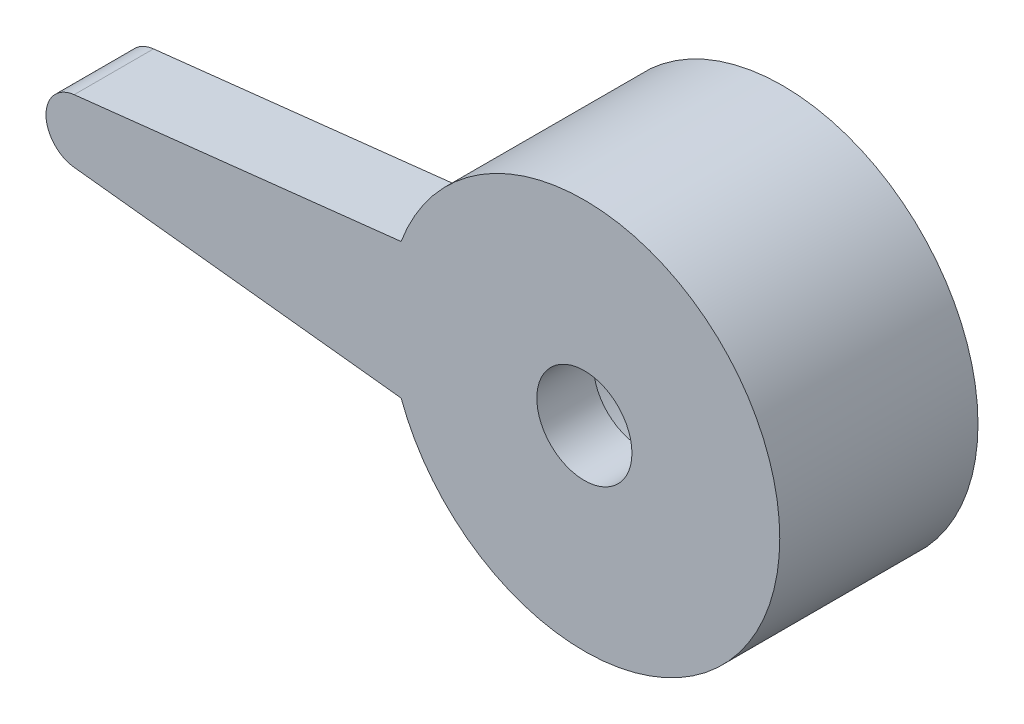
ISO-10303-21;
HEADER;
FILE_DESCRIPTION(('STEP AP214'),'2;1');
FILE_NAME('part.step','',(''),(''),'','','');
FILE_SCHEMA(('AUTOMOTIVE_DESIGN { 1 0 10303 214 1 1 1 1 }'));
ENDSEC;
DATA;
#1=APPLICATION_CONTEXT('core data for automotive mechanical design processes');
#2=APPLICATION_PROTOCOL_DEFINITION('international standard','automotive_design',2000,#1);
#3=PRODUCT_CONTEXT('',#1,'mechanical');
#4=PRODUCT('Part','Part','',(#3));
#5=PRODUCT_RELATED_PRODUCT_CATEGORY('part','',(#4));
#6=PRODUCT_DEFINITION_FORMATION('','',#4);
#7=PRODUCT_DEFINITION_CONTEXT('part definition',#1,'design');
#8=PRODUCT_DEFINITION('design','',#6,#7);
#9=PRODUCT_DEFINITION_SHAPE('','',#8);
#10=(LENGTH_UNIT() NAMED_UNIT(*) SI_UNIT(.MILLI.,.METRE.));
#11=(NAMED_UNIT(*) PLANE_ANGLE_UNIT() SI_UNIT($,.RADIAN.));
#12=(NAMED_UNIT(*) SI_UNIT($,.STERADIAN.) SOLID_ANGLE_UNIT());
#13=UNCERTAINTY_MEASURE_WITH_UNIT(LENGTH_MEASURE(1.E-05),#10,'distance_accuracy_value','');
#14=(GEOMETRIC_REPRESENTATION_CONTEXT(3) GLOBAL_UNCERTAINTY_ASSIGNED_CONTEXT((#13)) GLOBAL_UNIT_ASSIGNED_CONTEXT((#10,
#11,#12)) REPRESENTATION_CONTEXT('',''));
#15=CARTESIAN_POINT('',(0.,0.,0.));
#16=DIRECTION('',(0.,0.,1.));
#17=DIRECTION('',(1.,0.,0.));
#18=AXIS2_PLACEMENT_3D('',#15,#16,#17);
#19=CARTESIAN_POINT('',(0.,0.,-3.5));
#20=DIRECTION('',(0.,0.,1.));
#21=DIRECTION('',(1.,0.,0.));
#22=AXIS2_PLACEMENT_3D('',#19,#20,#21);
#23=CYLINDRICAL_SURFACE('',#22,3.45);
#24=DIRECTION('',(0.,0.,1.));
#25=VECTOR('',#24,1.);
#26=CARTESIAN_POINT('',(-3.23564173431961,-1.19713097325613,-1.4));
#27=LINE('',#26,#25);
#28=CARTESIAN_POINT('',(-3.23564173431961,-1.19713097325613,-1.4));
#29=VERTEX_POINT('',#28);
#30=CARTESIAN_POINT('',(-3.23564173431961,-1.19713097325613,0.));
#31=VERTEX_POINT('',#30);
#32=EDGE_CURVE('E119',#29,#31,#27,.T.);
#33=ORIENTED_EDGE('',*,*,#32,.F.);
#34=CARTESIAN_POINT('',(0.,0.,-1.4));
#35=DIRECTION('',(0.,0.,-1.));
#36=DIRECTION('',(1.,0.,0.));
#37=AXIS2_PLACEMENT_3D('',#34,#35,#36);
#38=CIRCLE('',#37,3.45);
#39=CARTESIAN_POINT('',(-3.23564173431961,1.19713097325613,-1.4));
#40=VERTEX_POINT('',#39);
#41=EDGE_CURVE('E65',#29,#40,#38,.T.);
#42=ORIENTED_EDGE('',*,*,#41,.T.);
#43=DIRECTION('',(0.,0.,1.));
#44=VECTOR('',#43,1.);
#45=CARTESIAN_POINT('',(-3.23564173431961,1.19713097325613,-1.4));
#46=LINE('',#45,#44);
#47=CARTESIAN_POINT('',(-3.23564173431961,1.19713097325613,0.));
#48=VERTEX_POINT('',#47);
#49=EDGE_CURVE('E89',#40,#48,#46,.T.);
#50=ORIENTED_EDGE('',*,*,#49,.T.);
#51=CARTESIAN_POINT('',(0.,0.,0.));
#52=DIRECTION('',(0.,0.,1.));
#53=DIRECTION('',(1.,0.,0.));
#54=AXIS2_PLACEMENT_3D('',#51,#52,#53);
#55=CIRCLE('',#54,3.45);
#56=EDGE_CURVE('E48',#31,#48,#55,.T.);
#57=ORIENTED_EDGE('',*,*,#56,.F.);
#58=EDGE_LOOP('',(#33,#42,#50,#57));
#59=FACE_BOUND('',#58,.T.);
#60=CARTESIAN_POINT('',(0.,0.,-3.5));
#61=DIRECTION('',(0.,0.,1.));
#62=DIRECTION('',(1.,0.,0.));
#63=AXIS2_PLACEMENT_3D('',#60,#61,#62);
#64=CIRCLE('',#63,3.45);
#65=CARTESIAN_POINT('',(3.45,0.,-3.5));
#66=VERTEX_POINT('',#65);
#67=EDGE_CURVE('E11',#66,#66,#64,.T.);
#68=ORIENTED_EDGE('',*,*,#67,.T.);
#69=EDGE_LOOP('',(#68));
#70=FACE_BOUND('',#69,.T.);
#71=ADVANCED_FACE('F39',(#59,#70),#23,.T.);
#72=CARTESIAN_POINT('',(0.,0.,-3.5));
#73=DIRECTION('',(0.,0.,1.));
#74=DIRECTION('',(1.,0.,0.));
#75=AXIS2_PLACEMENT_3D('',#72,#73,#74);
#76=PLANE('',#75);
#77=CARTESIAN_POINT('',(0.,0.,-3.5));
#78=DIRECTION('',(0.,0.,1.));
#79=DIRECTION('',(1.,0.,0.));
#80=AXIS2_PLACEMENT_3D('',#77,#78,#79);
#81=CIRCLE('',#80,2.45);
#82=CARTESIAN_POINT('',(2.45,0.,-3.5));
#83=VERTEX_POINT('',#82);
#84=EDGE_CURVE('E134',#83,#83,#81,.F.);
#85=ORIENTED_EDGE('',*,*,#84,.F.);
#86=EDGE_LOOP('',(#85));
#87=FACE_BOUND('',#86,.T.);
#88=ORIENTED_EDGE('',*,*,#67,.F.);
#89=EDGE_LOOP('',(#88));
#90=FACE_BOUND('',#89,.T.);
#91=ADVANCED_FACE('F158',(#87,#90),#76,.F.);
#92=CARTESIAN_POINT('',(0.,0.,0.));
#93=DIRECTION('',(0.,0.,1.));
#94=DIRECTION('',(1.,0.,0.));
#95=AXIS2_PLACEMENT_3D('',#92,#93,#94);
#96=PLANE('',#95);
#97=CARTESIAN_POINT('',(0.,0.,0.));
#98=DIRECTION('',(0.,0.,1.));
#99=DIRECTION('',(1.,0.,0.));
#100=AXIS2_PLACEMENT_3D('',#97,#98,#99);
#101=CIRCLE('',#100,0.84);
#102=CARTESIAN_POINT('',(0.84,0.,0.));
#103=VERTEX_POINT('',#102);
#104=EDGE_CURVE('E126',#103,#103,#101,.T.);
#105=ORIENTED_EDGE('',*,*,#104,.F.);
#106=EDGE_LOOP('',(#105));
#107=FACE_BOUND('',#106,.T.);
#108=ORIENTED_EDGE('',*,*,#56,.T.);
#109=DIRECTION('',(-0.993891574605037,-0.110360943857508,0.));
#110=VECTOR('',#109,1.);
#111=CARTESIAN_POINT('',(-3.23564173431961,1.19713097325613,0.));
#112=LINE('',#111,#110);
#113=CARTESIAN_POINT('',(-9.00777639348574,0.556197650814644,0.));
#114=VERTEX_POINT('',#113);
#115=EDGE_CURVE('E112',#48,#114,#112,.T.);
#116=ORIENTED_EDGE('',*,*,#115,.T.);
#117=CARTESIAN_POINT('',(-8.94601664092961,0.,0.));
#118=DIRECTION('',(0.,0.,1.));
#119=DIRECTION('',(1.,0.,0.));
#120=AXIS2_PLACEMENT_3D('',#117,#118,#119);
#121=CIRCLE('',#120,0.559616023544291);
#122=CARTESIAN_POINT('',(-9.00777639348574,-0.556197650814645,0.));
#123=VERTEX_POINT('',#122);
#124=EDGE_CURVE('E95',#114,#123,#121,.T.);
#125=ORIENTED_EDGE('',*,*,#124,.T.);
#126=DIRECTION('',(0.993891574605037,-0.110360943857508,0.));
#127=VECTOR('',#126,1.);
#128=CARTESIAN_POINT('',(-3.23564173431961,-1.19713097325613,0.));
#129=LINE('',#128,#127);
#130=EDGE_CURVE('E56',#123,#31,#129,.T.);
#131=ORIENTED_EDGE('',*,*,#130,.T.);
#132=EDGE_LOOP('',(#108,#116,#125,#131));
#133=FACE_BOUND('',#132,.T.);
#134=ADVANCED_FACE('F139',(#107,#133),#96,.T.);
#135=CARTESIAN_POINT('',(0.,0.,-3.501));
#136=DIRECTION('',(0.,0.,1.));
#137=DIRECTION('',(1.,0.,0.));
#138=AXIS2_PLACEMENT_3D('',#135,#136,#137);
#139=CYLINDRICAL_SURFACE('',#138,2.45);
#140=CARTESIAN_POINT('',(0.,0.,-1.));
#141=DIRECTION('',(0.,0.,1.));
#142=DIRECTION('',(1.,0.,0.));
#143=AXIS2_PLACEMENT_3D('',#140,#141,#142);
#144=CIRCLE('',#143,2.45);
#145=CARTESIAN_POINT('',(2.45,0.,-1.));
#146=VERTEX_POINT('',#145);
#147=EDGE_CURVE('E130',#146,#146,#144,.T.);
#148=ORIENTED_EDGE('',*,*,#147,.T.);
#149=EDGE_LOOP('',(#148));
#150=FACE_BOUND('',#149,.T.);
#151=ORIENTED_EDGE('',*,*,#84,.T.);
#152=EDGE_LOOP('',(#151));
#153=FACE_BOUND('',#152,.T.);
#154=ADVANCED_FACE('F167',(#150,#153),#139,.F.);
#155=CARTESIAN_POINT('',(0.,0.,-1.));
#156=DIRECTION('',(0.,0.,1.));
#157=DIRECTION('',(1.,0.,0.));
#158=AXIS2_PLACEMENT_3D('',#155,#156,#157);
#159=PLANE('',#158);
#160=CARTESIAN_POINT('',(0.,0.,-1.));
#161=DIRECTION('',(0.,0.,1.));
#162=DIRECTION('',(1.,0.,0.));
#163=AXIS2_PLACEMENT_3D('',#160,#161,#162);
#164=CIRCLE('',#163,0.84);
#165=CARTESIAN_POINT('',(0.84,0.,-1.));
#166=VERTEX_POINT('',#165);
#167=EDGE_CURVE('E42',#166,#166,#164,.T.);
#168=ORIENTED_EDGE('',*,*,#167,.T.);
#169=EDGE_LOOP('',(#168));
#170=FACE_BOUND('',#169,.T.);
#171=ORIENTED_EDGE('',*,*,#147,.F.);
#172=EDGE_LOOP('',(#171));
#173=FACE_BOUND('',#172,.T.);
#174=ADVANCED_FACE('F153',(#170,#173),#159,.F.);
#175=CARTESIAN_POINT('',(0.,0.,-3.5));
#176=DIRECTION('',(0.,0.,1.));
#177=DIRECTION('',(1.,0.,0.));
#178=AXIS2_PLACEMENT_3D('',#175,#176,#177);
#179=CYLINDRICAL_SURFACE('',#178,0.84);
#180=ORIENTED_EDGE('',*,*,#104,.T.);
#181=EDGE_LOOP('',(#180));
#182=FACE_BOUND('',#181,.T.);
#183=ORIENTED_EDGE('',*,*,#167,.F.);
#184=EDGE_LOOP('',(#183));
#185=FACE_BOUND('',#184,.T.);
#186=ADVANCED_FACE('F146',(#182,#185),#179,.F.);
#187=CARTESIAN_POINT('',(-3.23564173431961,-1.19713097325613,-1.4));
#188=DIRECTION('',(-0.110360943857508,-0.993891574605037,0.));
#189=DIRECTION('',(0.993891574605037,-0.110360943857508,0.));
#190=AXIS2_PLACEMENT_3D('',#187,#188,#189);
#191=PLANE('',#190);
#192=ORIENTED_EDGE('',*,*,#130,.F.);
#193=DIRECTION('',(0.,0.,1.));
#194=VECTOR('',#193,1.);
#195=CARTESIAN_POINT('',(-9.00777639348574,-0.556197650814645,-1.4));
#196=LINE('',#195,#194);
#197=CARTESIAN_POINT('',(-9.00777639348574,-0.556197650814645,-1.4));
#198=VERTEX_POINT('',#197);
#199=EDGE_CURVE('E83',#198,#123,#196,.T.);
#200=ORIENTED_EDGE('',*,*,#199,.F.);
#201=DIRECTION('',(0.993891574605037,-0.110360943857508,0.));
#202=VECTOR('',#201,1.);
#203=CARTESIAN_POINT('',(-3.23564173431961,-1.19713097325613,-1.4));
#204=LINE('',#203,#202);
#205=EDGE_CURVE('E101',#198,#29,#204,.T.);
#206=ORIENTED_EDGE('',*,*,#205,.T.);
#207=ORIENTED_EDGE('',*,*,#32,.T.);
#208=EDGE_LOOP('',(#192,#200,#206,#207));
#209=FACE_BOUND('',#208,.T.);
#210=ADVANCED_FACE('F144',(#209),#191,.T.);
#211=CARTESIAN_POINT('',(-8.94601664092961,0.,-1.4));
#212=DIRECTION('',(0.,0.,1.));
#213=DIRECTION('',(1.,0.,0.));
#214=AXIS2_PLACEMENT_3D('',#211,#212,#213);
#215=CYLINDRICAL_SURFACE('',#214,0.559616023544291);
#216=ORIENTED_EDGE('',*,*,#124,.F.);
#217=DIRECTION('',(0.,0.,1.));
#218=VECTOR('',#217,1.);
#219=CARTESIAN_POINT('',(-9.00777639348574,0.556197650814644,-1.4));
#220=LINE('',#219,#218);
#221=CARTESIAN_POINT('',(-9.00777639348574,0.556197650814644,-1.4));
#222=VERTEX_POINT('',#221);
#223=EDGE_CURVE('E91',#222,#114,#220,.T.);
#224=ORIENTED_EDGE('',*,*,#223,.F.);
#225=CARTESIAN_POINT('',(-8.94601664092961,0.,-1.4));
#226=DIRECTION('',(0.,0.,1.));
#227=DIRECTION('',(1.,0.,0.));
#228=AXIS2_PLACEMENT_3D('',#225,#226,#227);
#229=CIRCLE('',#228,0.559616023544291);
#230=EDGE_CURVE('E94',#222,#198,#229,.T.);
#231=ORIENTED_EDGE('',*,*,#230,.T.);
#232=ORIENTED_EDGE('',*,*,#199,.T.);
#233=EDGE_LOOP('',(#216,#224,#231,#232));
#234=FACE_BOUND('',#233,.T.);
#235=ADVANCED_FACE('F93',(#234),#215,.T.);
#236=CARTESIAN_POINT('',(-3.23564173431961,1.19713097325613,-1.4));
#237=DIRECTION('',(-0.110360943857508,0.993891574605037,0.));
#238=DIRECTION('',(-0.993891574605037,-0.110360943857508,0.));
#239=AXIS2_PLACEMENT_3D('',#236,#237,#238);
#240=PLANE('',#239);
#241=ORIENTED_EDGE('',*,*,#115,.F.);
#242=ORIENTED_EDGE('',*,*,#49,.F.);
#243=DIRECTION('',(-0.993891574605037,-0.110360943857508,0.));
#244=VECTOR('',#243,1.);
#245=CARTESIAN_POINT('',(-3.23564173431961,1.19713097325613,-1.4));
#246=LINE('',#245,#244);
#247=EDGE_CURVE('E100',#40,#222,#246,.T.);
#248=ORIENTED_EDGE('',*,*,#247,.T.);
#249=ORIENTED_EDGE('',*,*,#223,.T.);
#250=EDGE_LOOP('',(#241,#242,#248,#249));
#251=FACE_BOUND('',#250,.T.);
#252=ADVANCED_FACE('F104',(#251),#240,.T.);
#253=CARTESIAN_POINT('',(0.,0.,-1.4));
#254=DIRECTION('',(0.,0.,1.));
#255=DIRECTION('',(1.,0.,0.));
#256=AXIS2_PLACEMENT_3D('',#253,#254,#255);
#257=PLANE('',#256);
#258=ORIENTED_EDGE('',*,*,#41,.F.);
#259=ORIENTED_EDGE('',*,*,#205,.F.);
#260=ORIENTED_EDGE('',*,*,#230,.F.);
#261=ORIENTED_EDGE('',*,*,#247,.F.);
#262=EDGE_LOOP('',(#258,#259,#260,#261));
#263=FACE_BOUND('',#262,.T.);
#264=ADVANCED_FACE('F99',(#263),#257,.F.);
#265=CLOSED_SHELL('',(#71,#91,#134,#154,#174,#186,#210,#235,#252,#264));
#266=MANIFOLD_SOLID_BREP('B2',#265);
#267=ADVANCED_BREP_SHAPE_REPRESENTATION('',(#18,#266),#14);
#268=SHAPE_DEFINITION_REPRESENTATION(#9,#267);
ENDSEC;
END-ISO-10303-21;
